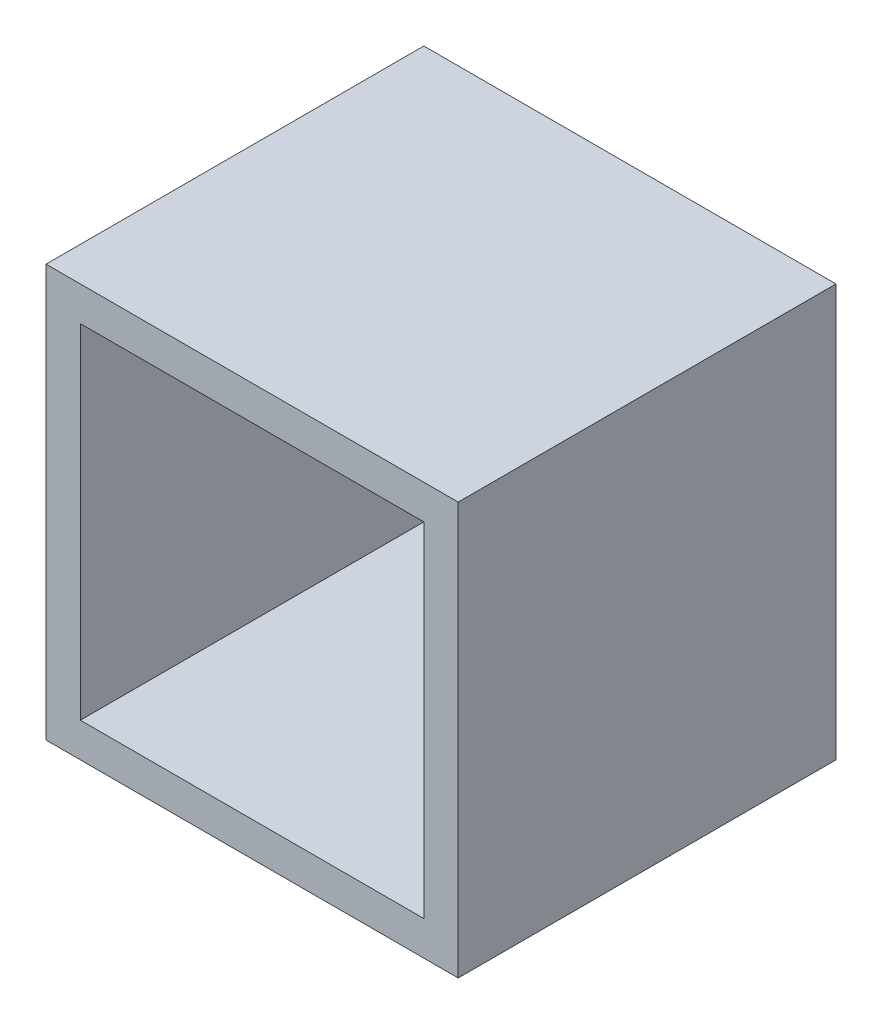
ISO-10303-21;
HEADER;
FILE_DESCRIPTION(('STEP AP214'),'2;1');
FILE_NAME('part.step','',(''),(''),'','','');
FILE_SCHEMA(('AUTOMOTIVE_DESIGN { 1 0 10303 214 1 1 1 1 }'));
ENDSEC;
DATA;
#1=APPLICATION_CONTEXT('core data for automotive mechanical design processes');
#2=APPLICATION_PROTOCOL_DEFINITION('international standard','automotive_design',2000,#1);
#3=PRODUCT_CONTEXT('',#1,'mechanical');
#4=PRODUCT('Part','Part','',(#3));
#5=PRODUCT_RELATED_PRODUCT_CATEGORY('part','',(#4));
#6=PRODUCT_DEFINITION_FORMATION('','',#4);
#7=PRODUCT_DEFINITION_CONTEXT('part definition',#1,'design');
#8=PRODUCT_DEFINITION('design','',#6,#7);
#9=PRODUCT_DEFINITION_SHAPE('','',#8);
#10=(LENGTH_UNIT() NAMED_UNIT(*) SI_UNIT(.MILLI.,.METRE.));
#11=(NAMED_UNIT(*) PLANE_ANGLE_UNIT() SI_UNIT($,.RADIAN.));
#12=(NAMED_UNIT(*) SI_UNIT($,.STERADIAN.) SOLID_ANGLE_UNIT());
#13=UNCERTAINTY_MEASURE_WITH_UNIT(LENGTH_MEASURE(1.E-05),#10,'distance_accuracy_value','');
#14=(GEOMETRIC_REPRESENTATION_CONTEXT(3) GLOBAL_UNCERTAINTY_ASSIGNED_CONTEXT((#13)) GLOBAL_UNIT_ASSIGNED_CONTEXT((#10,
#11,#12)) REPRESENTATION_CONTEXT('',''));
#15=CARTESIAN_POINT('',(0.,0.,0.));
#16=DIRECTION('',(0.,0.,1.));
#17=DIRECTION('',(1.,0.,0.));
#18=AXIS2_PLACEMENT_3D('',#15,#16,#17);
#19=CARTESIAN_POINT('',(-500.,0.,5000.));
#20=DIRECTION('',(1.,0.,0.));
#21=DIRECTION('',(0.,0.,-1.));
#22=AXIS2_PLACEMENT_3D('',#19,#20,#21);
#23=PLANE('',#22);
#24=DIRECTION('',(0.,-1.,0.));
#25=VECTOR('',#24,1.);
#26=CARTESIAN_POINT('',(-500.,0.,-500.));
#27=LINE('',#26,#25);
#28=CARTESIAN_POINT('',(-500.,500.,-500.));
#29=VERTEX_POINT('',#28);
#30=CARTESIAN_POINT('',(-500.,-5500.,-500.));
#31=VERTEX_POINT('',#30);
#32=EDGE_CURVE('E140',#29,#31,#27,.T.);
#33=ORIENTED_EDGE('',*,*,#32,.T.);
#34=DIRECTION('',(0.,0.,-1.));
#35=VECTOR('',#34,1.);
#36=CARTESIAN_POINT('',(-500.,-5500.,5000.));
#37=LINE('',#36,#35);
#38=CARTESIAN_POINT('',(-500.,-5500.,5000.));
#39=VERTEX_POINT('',#38);
#40=EDGE_CURVE('E11',#39,#31,#37,.T.);
#41=ORIENTED_EDGE('',*,*,#40,.F.);
#42=DIRECTION('',(0.,-1.,0.));
#43=VECTOR('',#42,1.);
#44=CARTESIAN_POINT('',(-500.,0.,5000.));
#45=LINE('',#44,#43);
#46=CARTESIAN_POINT('',(-500.,500.,5000.));
#47=VERTEX_POINT('',#46);
#48=EDGE_CURVE('E193',#47,#39,#45,.T.);
#49=ORIENTED_EDGE('',*,*,#48,.F.);
#50=DIRECTION('',(0.,0.,-1.));
#51=VECTOR('',#50,1.);
#52=CARTESIAN_POINT('',(-500.,500.,5000.));
#53=LINE('',#52,#51);
#54=EDGE_CURVE('E174',#47,#29,#53,.T.);
#55=ORIENTED_EDGE('',*,*,#54,.T.);
#56=EDGE_LOOP('',(#33,#41,#49,#55));
#57=FACE_BOUND('',#56,.T.);
#58=ADVANCED_FACE('F49',(#57),#23,.F.);
#59=CARTESIAN_POINT('',(0.,-5500.,5000.));
#60=DIRECTION('',(0.,1.,0.));
#61=DIRECTION('',(0.,0.,1.));
#62=AXIS2_PLACEMENT_3D('',#59,#60,#61);
#63=PLANE('',#62);
#64=DIRECTION('',(1.,0.,0.));
#65=VECTOR('',#64,1.);
#66=CARTESIAN_POINT('',(0.,-5500.,-500.));
#67=LINE('',#66,#65);
#68=CARTESIAN_POINT('',(5500.,-5500.,-500.));
#69=VERTEX_POINT('',#68);
#70=EDGE_CURVE('E172',#31,#69,#67,.T.);
#71=ORIENTED_EDGE('',*,*,#70,.T.);
#72=DIRECTION('',(0.,0.,-1.));
#73=VECTOR('',#72,1.);
#74=CARTESIAN_POINT('',(5500.,-5500.,5000.));
#75=LINE('',#74,#73);
#76=CARTESIAN_POINT('',(5500.,-5500.,5000.));
#77=VERTEX_POINT('',#76);
#78=EDGE_CURVE('E59',#77,#69,#75,.T.);
#79=ORIENTED_EDGE('',*,*,#78,.F.);
#80=DIRECTION('',(1.,0.,0.));
#81=VECTOR('',#80,1.);
#82=CARTESIAN_POINT('',(0.,-5500.,5000.));
#83=LINE('',#82,#81);
#84=EDGE_CURVE('E196',#39,#77,#83,.T.);
#85=ORIENTED_EDGE('',*,*,#84,.F.);
#86=ORIENTED_EDGE('',*,*,#40,.T.);
#87=EDGE_LOOP('',(#71,#79,#85,#86));
#88=FACE_BOUND('',#87,.T.);
#89=ADVANCED_FACE('F215',(#88),#63,.F.);
#90=CARTESIAN_POINT('',(5500.,0.,5000.));
#91=DIRECTION('',(-1.,0.,0.));
#92=DIRECTION('',(0.,-1.,0.));
#93=AXIS2_PLACEMENT_3D('',#90,#91,#92);
#94=PLANE('',#93);
#95=DIRECTION('',(0.,1.,0.));
#96=VECTOR('',#95,1.);
#97=CARTESIAN_POINT('',(5500.,0.,-500.));
#98=LINE('',#97,#96);
#99=CARTESIAN_POINT('',(5500.,500.,-500.));
#100=VERTEX_POINT('',#99);
#101=EDGE_CURVE('E181',#69,#100,#98,.T.);
#102=ORIENTED_EDGE('',*,*,#101,.T.);
#103=DIRECTION('',(0.,0.,-1.));
#104=VECTOR('',#103,1.);
#105=CARTESIAN_POINT('',(5500.,500.,5000.));
#106=LINE('',#105,#104);
#107=CARTESIAN_POINT('',(5500.,500.,5000.));
#108=VERTEX_POINT('',#107);
#109=EDGE_CURVE('E178',#108,#100,#106,.T.);
#110=ORIENTED_EDGE('',*,*,#109,.F.);
#111=DIRECTION('',(0.,1.,0.));
#112=VECTOR('',#111,1.);
#113=CARTESIAN_POINT('',(5500.,0.,5000.));
#114=LINE('',#113,#112);
#115=EDGE_CURVE('E198',#77,#108,#114,.T.);
#116=ORIENTED_EDGE('',*,*,#115,.F.);
#117=ORIENTED_EDGE('',*,*,#78,.T.);
#118=EDGE_LOOP('',(#102,#110,#116,#117));
#119=FACE_BOUND('',#118,.T.);
#120=ADVANCED_FACE('F205',(#119),#94,.F.);
#121=CARTESIAN_POINT('',(0.,500.,5000.));
#122=DIRECTION('',(0.,-1.,0.));
#123=DIRECTION('',(0.,0.,-1.));
#124=AXIS2_PLACEMENT_3D('',#121,#122,#123);
#125=PLANE('',#124);
#126=DIRECTION('',(-1.,0.,0.));
#127=VECTOR('',#126,1.);
#128=CARTESIAN_POINT('',(0.,500.,-500.));
#129=LINE('',#128,#127);
#130=EDGE_CURVE('E187',#100,#29,#129,.T.);
#131=ORIENTED_EDGE('',*,*,#130,.T.);
#132=ORIENTED_EDGE('',*,*,#54,.F.);
#133=DIRECTION('',(-1.,0.,0.));
#134=VECTOR('',#133,1.);
#135=CARTESIAN_POINT('',(0.,500.,5000.));
#136=LINE('',#135,#134);
#137=EDGE_CURVE('E53',#108,#47,#136,.T.);
#138=ORIENTED_EDGE('',*,*,#137,.F.);
#139=ORIENTED_EDGE('',*,*,#109,.T.);
#140=EDGE_LOOP('',(#131,#132,#138,#139));
#141=FACE_BOUND('',#140,.T.);
#142=ADVANCED_FACE('F209',(#141),#125,.F.);
#143=CARTESIAN_POINT('',(0.,0.,5000.));
#144=DIRECTION('',(0.,0.,1.));
#145=DIRECTION('',(1.,0.,0.));
#146=AXIS2_PLACEMENT_3D('',#143,#144,#145);
#147=PLANE('',#146);
#148=DIRECTION('',(0.,-1.,0.));
#149=VECTOR('',#148,1.);
#150=CARTESIAN_POINT('',(0.,0.,5000.));
#151=LINE('',#150,#149);
#152=CARTESIAN_POINT('',(0.,0.,5000.));
#153=VERTEX_POINT('',#152);
#154=CARTESIAN_POINT('',(0.,-5000.,5000.));
#155=VERTEX_POINT('',#154);
#156=EDGE_CURVE('E119',#153,#155,#151,.T.);
#157=ORIENTED_EDGE('',*,*,#156,.F.);
#158=DIRECTION('',(-1.,0.,0.));
#159=VECTOR('',#158,1.);
#160=CARTESIAN_POINT('',(0.,0.,5000.));
#161=LINE('',#160,#159);
#162=CARTESIAN_POINT('',(5000.,0.,5000.));
#163=VERTEX_POINT('',#162);
#164=EDGE_CURVE('E149',#163,#153,#161,.T.);
#165=ORIENTED_EDGE('',*,*,#164,.F.);
#166=DIRECTION('',(0.,1.,0.));
#167=VECTOR('',#166,1.);
#168=CARTESIAN_POINT('',(5000.,0.,5000.));
#169=LINE('',#168,#167);
#170=CARTESIAN_POINT('',(5000.,-5000.,5000.));
#171=VERTEX_POINT('',#170);
#172=EDGE_CURVE('E145',#171,#163,#169,.T.);
#173=ORIENTED_EDGE('',*,*,#172,.F.);
#174=DIRECTION('',(1.,0.,0.));
#175=VECTOR('',#174,1.);
#176=CARTESIAN_POINT('',(0.,-5000.,5000.));
#177=LINE('',#176,#175);
#178=EDGE_CURVE('E131',#155,#171,#177,.T.);
#179=ORIENTED_EDGE('',*,*,#178,.F.);
#180=EDGE_LOOP('',(#157,#165,#173,#179));
#181=FACE_BOUND('',#180,.T.);
#182=ORIENTED_EDGE('',*,*,#48,.T.);
#183=ORIENTED_EDGE('',*,*,#84,.T.);
#184=ORIENTED_EDGE('',*,*,#115,.T.);
#185=ORIENTED_EDGE('',*,*,#137,.T.);
#186=EDGE_LOOP('',(#182,#183,#184,#185));
#187=FACE_BOUND('',#186,.T.);
#188=ADVANCED_FACE('F144',(#181,#187),#147,.T.);
#189=CARTESIAN_POINT('',(0.,0.,-500.));
#190=DIRECTION('',(0.,0.,1.));
#191=DIRECTION('',(1.,0.,0.));
#192=AXIS2_PLACEMENT_3D('',#189,#190,#191);
#193=PLANE('',#192);
#194=ORIENTED_EDGE('',*,*,#32,.F.);
#195=ORIENTED_EDGE('',*,*,#130,.F.);
#196=ORIENTED_EDGE('',*,*,#101,.F.);
#197=ORIENTED_EDGE('',*,*,#70,.F.);
#198=EDGE_LOOP('',(#194,#195,#196,#197));
#199=FACE_BOUND('',#198,.T.);
#200=ADVANCED_FACE('F51',(#199),#193,.F.);
#201=CARTESIAN_POINT('',(0.,0.,5000.));
#202=DIRECTION('',(1.,0.,0.));
#203=DIRECTION('',(0.,0.,-1.));
#204=AXIS2_PLACEMENT_3D('',#201,#202,#203);
#205=PLANE('',#204);
#206=DIRECTION('',(0.,-1.,0.));
#207=VECTOR('',#206,1.);
#208=CARTESIAN_POINT('',(0.,0.,0.));
#209=LINE('',#208,#207);
#210=CARTESIAN_POINT('',(0.,0.,0.));
#211=VERTEX_POINT('',#210);
#212=CARTESIAN_POINT('',(0.,-5000.,0.));
#213=VERTEX_POINT('',#212);
#214=EDGE_CURVE('E154',#211,#213,#209,.T.);
#215=ORIENTED_EDGE('',*,*,#214,.F.);
#216=DIRECTION('',(0.,0.,-1.));
#217=VECTOR('',#216,1.);
#218=CARTESIAN_POINT('',(0.,0.,5000.));
#219=LINE('',#218,#217);
#220=EDGE_CURVE('E126',#153,#211,#219,.T.);
#221=ORIENTED_EDGE('',*,*,#220,.F.);
#222=ORIENTED_EDGE('',*,*,#156,.T.);
#223=DIRECTION('',(0.,0.,-1.));
#224=VECTOR('',#223,1.);
#225=CARTESIAN_POINT('',(0.,-5000.,5000.));
#226=LINE('',#225,#224);
#227=EDGE_CURVE('E123',#155,#213,#226,.T.);
#228=ORIENTED_EDGE('',*,*,#227,.T.);
#229=EDGE_LOOP('',(#215,#221,#222,#228));
#230=FACE_BOUND('',#229,.T.);
#231=ADVANCED_FACE('F122',(#230),#205,.T.);
#232=CARTESIAN_POINT('',(0.,-5000.,5000.));
#233=DIRECTION('',(0.,1.,0.));
#234=DIRECTION('',(0.,0.,1.));
#235=AXIS2_PLACEMENT_3D('',#232,#233,#234);
#236=PLANE('',#235);
#237=DIRECTION('',(1.,0.,0.));
#238=VECTOR('',#237,1.);
#239=CARTESIAN_POINT('',(0.,-5000.,0.));
#240=LINE('',#239,#238);
#241=CARTESIAN_POINT('',(5000.,-5000.,0.));
#242=VERTEX_POINT('',#241);
#243=EDGE_CURVE('E138',#213,#242,#240,.T.);
#244=ORIENTED_EDGE('',*,*,#243,.F.);
#245=ORIENTED_EDGE('',*,*,#227,.F.);
#246=ORIENTED_EDGE('',*,*,#178,.T.);
#247=DIRECTION('',(0.,0.,-1.));
#248=VECTOR('',#247,1.);
#249=CARTESIAN_POINT('',(5000.,-5000.,5000.));
#250=LINE('',#249,#248);
#251=EDGE_CURVE('E141',#171,#242,#250,.T.);
#252=ORIENTED_EDGE('',*,*,#251,.T.);
#253=EDGE_LOOP('',(#244,#245,#246,#252));
#254=FACE_BOUND('',#253,.T.);
#255=ADVANCED_FACE('F135',(#254),#236,.T.);
#256=CARTESIAN_POINT('',(5000.,0.,5000.));
#257=DIRECTION('',(-1.,0.,0.));
#258=DIRECTION('',(0.,-1.,0.));
#259=AXIS2_PLACEMENT_3D('',#256,#257,#258);
#260=PLANE('',#259);
#261=DIRECTION('',(0.,1.,0.));
#262=VECTOR('',#261,1.);
#263=CARTESIAN_POINT('',(5000.,0.,0.));
#264=LINE('',#263,#262);
#265=CARTESIAN_POINT('',(5000.,0.,0.));
#266=VERTEX_POINT('',#265);
#267=EDGE_CURVE('E159',#242,#266,#264,.T.);
#268=ORIENTED_EDGE('',*,*,#267,.F.);
#269=ORIENTED_EDGE('',*,*,#251,.F.);
#270=ORIENTED_EDGE('',*,*,#172,.T.);
#271=DIRECTION('',(0.,0.,-1.));
#272=VECTOR('',#271,1.);
#273=CARTESIAN_POINT('',(5000.,0.,5000.));
#274=LINE('',#273,#272);
#275=EDGE_CURVE('E67',#163,#266,#274,.T.);
#276=ORIENTED_EDGE('',*,*,#275,.T.);
#277=EDGE_LOOP('',(#268,#269,#270,#276));
#278=FACE_BOUND('',#277,.T.);
#279=ADVANCED_FACE('F262',(#278),#260,.T.);
#280=CARTESIAN_POINT('',(0.,0.,5000.));
#281=DIRECTION('',(0.,-1.,0.));
#282=DIRECTION('',(0.,0.,-1.));
#283=AXIS2_PLACEMENT_3D('',#280,#281,#282);
#284=PLANE('',#283);
#285=DIRECTION('',(-1.,0.,0.));
#286=VECTOR('',#285,1.);
#287=CARTESIAN_POINT('',(0.,0.,0.));
#288=LINE('',#287,#286);
#289=EDGE_CURVE('E132',#266,#211,#288,.T.);
#290=ORIENTED_EDGE('',*,*,#289,.F.);
#291=ORIENTED_EDGE('',*,*,#275,.F.);
#292=ORIENTED_EDGE('',*,*,#164,.T.);
#293=ORIENTED_EDGE('',*,*,#220,.T.);
#294=EDGE_LOOP('',(#290,#291,#292,#293));
#295=FACE_BOUND('',#294,.T.);
#296=ADVANCED_FACE('F271',(#295),#284,.T.);
#297=CARTESIAN_POINT('',(0.,0.,0.));
#298=DIRECTION('',(0.,0.,1.));
#299=DIRECTION('',(1.,0.,0.));
#300=AXIS2_PLACEMENT_3D('',#297,#298,#299);
#301=PLANE('',#300);
#302=ORIENTED_EDGE('',*,*,#214,.T.);
#303=ORIENTED_EDGE('',*,*,#243,.T.);
#304=ORIENTED_EDGE('',*,*,#267,.T.);
#305=ORIENTED_EDGE('',*,*,#289,.T.);
#306=EDGE_LOOP('',(#302,#303,#304,#305));
#307=FACE_BOUND('',#306,.T.);
#308=ADVANCED_FACE('F281',(#307),#301,.T.);
#309=CLOSED_SHELL('',(#58,#89,#120,#142,#188,#200,#231,#255,#279,#296,#308));
#310=MANIFOLD_SOLID_BREP('B2',#309);
#311=ADVANCED_BREP_SHAPE_REPRESENTATION('',(#18,#310),#14);
#312=SHAPE_DEFINITION_REPRESENTATION(#9,#311);
ENDSEC;
END-ISO-10303-21;
